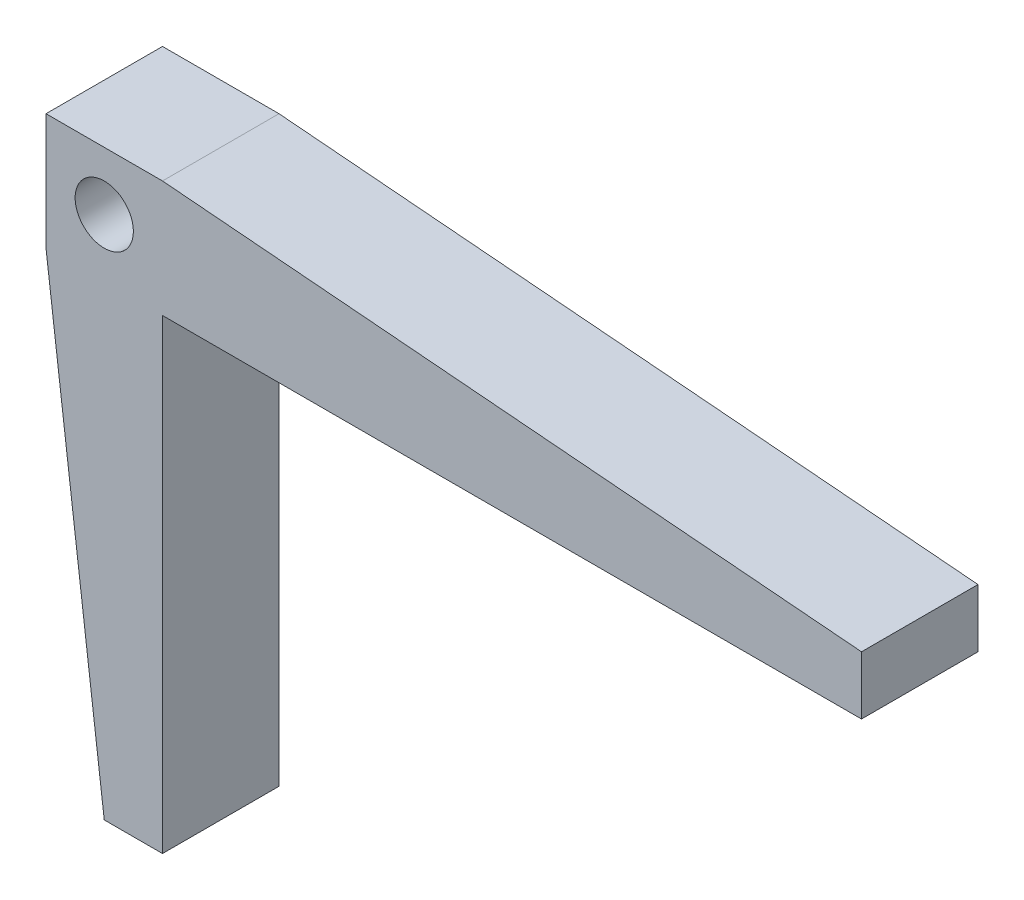
ISO-10303-21;
HEADER;
FILE_DESCRIPTION(('STEP AP214'),'2;1');
FILE_NAME('part.step','',(''),(''),'','','');
FILE_SCHEMA(('AUTOMOTIVE_DESIGN { 1 0 10303 214 1 1 1 1 }'));
ENDSEC;
DATA;
#1=APPLICATION_CONTEXT('core data for automotive mechanical design processes');
#2=APPLICATION_PROTOCOL_DEFINITION('international standard','automotive_design',2000,#1);
#3=PRODUCT_CONTEXT('',#1,'mechanical');
#4=PRODUCT('Part','Part','',(#3));
#5=PRODUCT_RELATED_PRODUCT_CATEGORY('part','',(#4));
#6=PRODUCT_DEFINITION_FORMATION('','',#4);
#7=PRODUCT_DEFINITION_CONTEXT('part definition',#1,'design');
#8=PRODUCT_DEFINITION('design','',#6,#7);
#9=PRODUCT_DEFINITION_SHAPE('','',#8);
#10=(LENGTH_UNIT() NAMED_UNIT(*) SI_UNIT(.MILLI.,.METRE.));
#11=(NAMED_UNIT(*) PLANE_ANGLE_UNIT() SI_UNIT($,.RADIAN.));
#12=(NAMED_UNIT(*) SI_UNIT($,.STERADIAN.) SOLID_ANGLE_UNIT());
#13=UNCERTAINTY_MEASURE_WITH_UNIT(LENGTH_MEASURE(1.E-05),#10,'distance_accuracy_value','');
#14=(GEOMETRIC_REPRESENTATION_CONTEXT(3) GLOBAL_UNCERTAINTY_ASSIGNED_CONTEXT((#13)) GLOBAL_UNIT_ASSIGNED_CONTEXT((#10,
#11,#12)) REPRESENTATION_CONTEXT('',''));
#15=CARTESIAN_POINT('',(0.,0.,0.));
#16=DIRECTION('',(0.,0.,1.));
#17=DIRECTION('',(1.,0.,0.));
#18=AXIS2_PLACEMENT_3D('',#15,#16,#17);
#19=CARTESIAN_POINT('',(0.,0.,25.4));
#20=DIRECTION('',(0.,0.,1.));
#21=DIRECTION('',(1.,0.,0.));
#22=AXIS2_PLACEMENT_3D('',#19,#20,#21);
#23=PLANE('',#22);
#24=DIRECTION('',(1.,0.,0.));
#25=VECTOR('',#24,1.);
#26=CARTESIAN_POINT('',(152.4,0.,25.4));
#27=LINE('',#26,#25);
#28=CARTESIAN_POINT('',(0.,0.,25.4));
#29=VERTEX_POINT('',#28);
#30=CARTESIAN_POINT('',(152.4,0.,25.4));
#31=VERTEX_POINT('',#30);
#32=EDGE_CURVE('E145',#29,#31,#27,.T.);
#33=ORIENTED_EDGE('',*,*,#32,.T.);
#34=DIRECTION('',(0.,1.,0.));
#35=VECTOR('',#34,1.);
#36=CARTESIAN_POINT('',(152.4,12.7,25.4));
#37=LINE('',#36,#35);
#38=CARTESIAN_POINT('',(152.4,12.7,25.4));
#39=VERTEX_POINT('',#38);
#40=EDGE_CURVE('E93',#31,#39,#37,.T.);
#41=ORIENTED_EDGE('',*,*,#40,.T.);
#42=DIRECTION('',(-0.99654575824488,0.0830454798537398,0.));
#43=VECTOR('',#42,1.);
#44=CARTESIAN_POINT('',(0.,25.4,25.4));
#45=LINE('',#44,#43);
#46=CARTESIAN_POINT('',(0.,25.4,25.4));
#47=VERTEX_POINT('',#46);
#48=EDGE_CURVE('E160',#39,#47,#45,.T.);
#49=ORIENTED_EDGE('',*,*,#48,.T.);
#50=DIRECTION('',(-1.,0.,0.));
#51=VECTOR('',#50,1.);
#52=CARTESIAN_POINT('',(-25.4,25.4,25.4));
#53=LINE('',#52,#51);
#54=CARTESIAN_POINT('',(-25.4,25.4,25.4));
#55=VERTEX_POINT('',#54);
#56=EDGE_CURVE('E173',#47,#55,#53,.T.);
#57=ORIENTED_EDGE('',*,*,#56,.T.);
#58=DIRECTION('',(0.,-1.,0.));
#59=VECTOR('',#58,1.);
#60=CARTESIAN_POINT('',(-25.4,0.,25.4));
#61=LINE('',#60,#59);
#62=CARTESIAN_POINT('',(-25.4,0.,25.4));
#63=VERTEX_POINT('',#62);
#64=EDGE_CURVE('E112',#55,#63,#61,.T.);
#65=ORIENTED_EDGE('',*,*,#64,.T.);
#66=DIRECTION('',(0.124034734589209,-0.992277876713668,0.));
#67=VECTOR('',#66,1.);
#68=CARTESIAN_POINT('',(-12.7,-101.6,25.4));
#69=LINE('',#68,#67);
#70=CARTESIAN_POINT('',(-12.7,-101.6,25.4));
#71=VERTEX_POINT('',#70);
#72=EDGE_CURVE('E106',#63,#71,#69,.T.);
#73=ORIENTED_EDGE('',*,*,#72,.T.);
#74=DIRECTION('',(1.,0.,0.));
#75=VECTOR('',#74,1.);
#76=CARTESIAN_POINT('',(0.,-101.6,25.4));
#77=LINE('',#76,#75);
#78=CARTESIAN_POINT('',(0.,-101.6,25.4));
#79=VERTEX_POINT('',#78);
#80=EDGE_CURVE('E110',#71,#79,#77,.T.);
#81=ORIENTED_EDGE('',*,*,#80,.T.);
#82=DIRECTION('',(0.,1.,0.));
#83=VECTOR('',#82,1.);
#84=CARTESIAN_POINT('',(0.,0.,25.4));
#85=LINE('',#84,#83);
#86=EDGE_CURVE('E50',#79,#29,#85,.T.);
#87=ORIENTED_EDGE('',*,*,#86,.T.);
#88=EDGE_LOOP('',(#33,#41,#49,#57,#65,#73,#81,#87));
#89=FACE_BOUND('',#88,.T.);
#90=CARTESIAN_POINT('',(-12.7,12.7,25.4));
#91=DIRECTION('',(0.,0.,1.));
#92=DIRECTION('',(1.,0.,0.));
#93=AXIS2_PLACEMENT_3D('',#90,#91,#92);
#94=CIRCLE('',#93,6.35);
#95=CARTESIAN_POINT('',(-6.34999999999999,12.7,25.4));
#96=VERTEX_POINT('',#95);
#97=EDGE_CURVE('E134',#96,#96,#94,.T.);
#98=ORIENTED_EDGE('',*,*,#97,.F.);
#99=EDGE_LOOP('',(#98));
#100=FACE_BOUND('',#99,.T.);
#101=ADVANCED_FACE('F33',(#89,#100),#23,.T.);
#102=CARTESIAN_POINT('',(0.,0.,0.));
#103=DIRECTION('',(0.,0.,1.));
#104=DIRECTION('',(1.,0.,0.));
#105=AXIS2_PLACEMENT_3D('',#102,#103,#104);
#106=PLANE('',#105);
#107=DIRECTION('',(1.,0.,0.));
#108=VECTOR('',#107,1.);
#109=CARTESIAN_POINT('',(152.4,0.,0.));
#110=LINE('',#109,#108);
#111=CARTESIAN_POINT('',(0.,0.,0.));
#112=VERTEX_POINT('',#111);
#113=CARTESIAN_POINT('',(152.4,0.,0.));
#114=VERTEX_POINT('',#113);
#115=EDGE_CURVE('E130',#112,#114,#110,.T.);
#116=ORIENTED_EDGE('',*,*,#115,.F.);
#117=DIRECTION('',(0.,1.,0.));
#118=VECTOR('',#117,1.);
#119=CARTESIAN_POINT('',(0.,0.,0.));
#120=LINE('',#119,#118);
#121=CARTESIAN_POINT('',(0.,-101.6,0.));
#122=VERTEX_POINT('',#121);
#123=EDGE_CURVE('E85',#122,#112,#120,.T.);
#124=ORIENTED_EDGE('',*,*,#123,.F.);
#125=DIRECTION('',(1.,0.,0.));
#126=VECTOR('',#125,1.);
#127=CARTESIAN_POINT('',(0.,-101.6,0.));
#128=LINE('',#127,#126);
#129=CARTESIAN_POINT('',(-12.7,-101.6,0.));
#130=VERTEX_POINT('',#129);
#131=EDGE_CURVE('E79',#130,#122,#128,.T.);
#132=ORIENTED_EDGE('',*,*,#131,.F.);
#133=DIRECTION('',(0.124034734589209,-0.992277876713668,0.));
#134=VECTOR('',#133,1.);
#135=CARTESIAN_POINT('',(-12.7,-101.6,0.));
#136=LINE('',#135,#134);
#137=CARTESIAN_POINT('',(-25.4,0.,0.));
#138=VERTEX_POINT('',#137);
#139=EDGE_CURVE('E120',#138,#130,#136,.T.);
#140=ORIENTED_EDGE('',*,*,#139,.F.);
#141=DIRECTION('',(0.,-1.,0.));
#142=VECTOR('',#141,1.);
#143=CARTESIAN_POINT('',(-25.4,0.,0.));
#144=LINE('',#143,#142);
#145=CARTESIAN_POINT('',(-25.4,25.4,0.));
#146=VERTEX_POINT('',#145);
#147=EDGE_CURVE('E140',#146,#138,#144,.T.);
#148=ORIENTED_EDGE('',*,*,#147,.F.);
#149=DIRECTION('',(-1.,0.,0.));
#150=VECTOR('',#149,1.);
#151=CARTESIAN_POINT('',(-25.4,25.4,0.));
#152=LINE('',#151,#150);
#153=CARTESIAN_POINT('',(0.,25.4,0.));
#154=VERTEX_POINT('',#153);
#155=EDGE_CURVE('E138',#154,#146,#152,.T.);
#156=ORIENTED_EDGE('',*,*,#155,.F.);
#157=DIRECTION('',(-0.99654575824488,0.0830454798537398,0.));
#158=VECTOR('',#157,1.);
#159=CARTESIAN_POINT('',(0.,25.4,0.));
#160=LINE('',#159,#158);
#161=CARTESIAN_POINT('',(152.4,12.7,0.));
#162=VERTEX_POINT('',#161);
#163=EDGE_CURVE('E136',#162,#154,#160,.T.);
#164=ORIENTED_EDGE('',*,*,#163,.F.);
#165=DIRECTION('',(0.,1.,0.));
#166=VECTOR('',#165,1.);
#167=CARTESIAN_POINT('',(152.4,12.7,0.));
#168=LINE('',#167,#166);
#169=EDGE_CURVE('E133',#114,#162,#168,.T.);
#170=ORIENTED_EDGE('',*,*,#169,.F.);
#171=EDGE_LOOP('',(#116,#124,#132,#140,#148,#156,#164,#170));
#172=FACE_BOUND('',#171,.T.);
#173=CARTESIAN_POINT('',(-12.7,12.7,0.));
#174=DIRECTION('',(0.,0.,1.));
#175=DIRECTION('',(1.,0.,0.));
#176=AXIS2_PLACEMENT_3D('',#173,#174,#175);
#177=CIRCLE('',#176,6.35);
#178=CARTESIAN_POINT('',(-6.34999999999999,12.7,0.));
#179=VERTEX_POINT('',#178);
#180=EDGE_CURVE('E179',#179,#179,#177,.T.);
#181=ORIENTED_EDGE('',*,*,#180,.T.);
#182=EDGE_LOOP('',(#181));
#183=FACE_BOUND('',#182,.T.);
#184=ADVANCED_FACE('F164',(#172,#183),#106,.F.);
#185=CARTESIAN_POINT('',(152.4,0.,25.4));
#186=DIRECTION('',(0.,1.,0.));
#187=DIRECTION('',(0.,0.,1.));
#188=AXIS2_PLACEMENT_3D('',#185,#186,#187);
#189=PLANE('',#188);
#190=ORIENTED_EDGE('',*,*,#115,.T.);
#191=DIRECTION('',(0.,0.,-1.));
#192=VECTOR('',#191,1.);
#193=CARTESIAN_POINT('',(152.4,0.,25.4));
#194=LINE('',#193,#192);
#195=EDGE_CURVE('E11',#31,#114,#194,.T.);
#196=ORIENTED_EDGE('',*,*,#195,.F.);
#197=ORIENTED_EDGE('',*,*,#32,.F.);
#198=DIRECTION('',(0.,0.,-1.));
#199=VECTOR('',#198,1.);
#200=CARTESIAN_POINT('',(0.,0.,25.4));
#201=LINE('',#200,#199);
#202=EDGE_CURVE('E126',#29,#112,#201,.T.);
#203=ORIENTED_EDGE('',*,*,#202,.T.);
#204=EDGE_LOOP('',(#190,#196,#197,#203));
#205=FACE_BOUND('',#204,.T.);
#206=ADVANCED_FACE('F35',(#205),#189,.F.);
#207=CARTESIAN_POINT('',(152.4,12.7,25.4));
#208=DIRECTION('',(-1.,0.,0.));
#209=DIRECTION('',(0.,0.,1.));
#210=AXIS2_PLACEMENT_3D('',#207,#208,#209);
#211=PLANE('',#210);
#212=ORIENTED_EDGE('',*,*,#169,.T.);
#213=DIRECTION('',(0.,0.,-1.));
#214=VECTOR('',#213,1.);
#215=CARTESIAN_POINT('',(152.4,12.7,25.4));
#216=LINE('',#215,#214);
#217=EDGE_CURVE('E42',#39,#162,#216,.T.);
#218=ORIENTED_EDGE('',*,*,#217,.F.);
#219=ORIENTED_EDGE('',*,*,#40,.F.);
#220=ORIENTED_EDGE('',*,*,#195,.T.);
#221=EDGE_LOOP('',(#212,#218,#219,#220));
#222=FACE_BOUND('',#221,.T.);
#223=ADVANCED_FACE('F207',(#222),#211,.F.);
#224=CARTESIAN_POINT('',(0.,25.4,25.4));
#225=DIRECTION('',(-0.0830454798537398,-0.99654575824488,0.));
#226=DIRECTION('',(0.99654575824488,-0.0830454798537398,0.));
#227=AXIS2_PLACEMENT_3D('',#224,#225,#226);
#228=PLANE('',#227);
#229=ORIENTED_EDGE('',*,*,#163,.T.);
#230=DIRECTION('',(0.,0.,-1.));
#231=VECTOR('',#230,1.);
#232=CARTESIAN_POINT('',(0.,25.4,25.4));
#233=LINE('',#232,#231);
#234=EDGE_CURVE('E152',#47,#154,#233,.T.);
#235=ORIENTED_EDGE('',*,*,#234,.F.);
#236=ORIENTED_EDGE('',*,*,#48,.F.);
#237=ORIENTED_EDGE('',*,*,#217,.T.);
#238=EDGE_LOOP('',(#229,#235,#236,#237));
#239=FACE_BOUND('',#238,.T.);
#240=ADVANCED_FACE('F158',(#239),#228,.F.);
#241=CARTESIAN_POINT('',(-25.4,25.4,25.4));
#242=DIRECTION('',(0.,-1.,0.));
#243=DIRECTION('',(0.,0.,-1.));
#244=AXIS2_PLACEMENT_3D('',#241,#242,#243);
#245=PLANE('',#244);
#246=ORIENTED_EDGE('',*,*,#155,.T.);
#247=DIRECTION('',(0.,0.,-1.));
#248=VECTOR('',#247,1.);
#249=CARTESIAN_POINT('',(-25.4,25.4,25.4));
#250=LINE('',#249,#248);
#251=EDGE_CURVE('E149',#55,#146,#250,.T.);
#252=ORIENTED_EDGE('',*,*,#251,.F.);
#253=ORIENTED_EDGE('',*,*,#56,.F.);
#254=ORIENTED_EDGE('',*,*,#234,.T.);
#255=EDGE_LOOP('',(#246,#252,#253,#254));
#256=FACE_BOUND('',#255,.T.);
#257=ADVANCED_FACE('F169',(#256),#245,.F.);
#258=CARTESIAN_POINT('',(-25.4,0.,25.4));
#259=DIRECTION('',(1.,0.,0.));
#260=DIRECTION('',(0.,0.,-1.));
#261=AXIS2_PLACEMENT_3D('',#258,#259,#260);
#262=PLANE('',#261);
#263=ORIENTED_EDGE('',*,*,#147,.T.);
#264=DIRECTION('',(0.,0.,-1.));
#265=VECTOR('',#264,1.);
#266=CARTESIAN_POINT('',(-25.4,0.,25.4));
#267=LINE('',#266,#265);
#268=EDGE_CURVE('E121',#63,#138,#267,.T.);
#269=ORIENTED_EDGE('',*,*,#268,.F.);
#270=ORIENTED_EDGE('',*,*,#64,.F.);
#271=ORIENTED_EDGE('',*,*,#251,.T.);
#272=EDGE_LOOP('',(#263,#269,#270,#271));
#273=FACE_BOUND('',#272,.T.);
#274=ADVANCED_FACE('F172',(#273),#262,.F.);
#275=CARTESIAN_POINT('',(-12.7,-101.6,25.4));
#276=DIRECTION('',(0.992277876713668,0.124034734589209,0.));
#277=DIRECTION('',(-0.124034734589209,0.992277876713668,0.));
#278=AXIS2_PLACEMENT_3D('',#275,#276,#277);
#279=PLANE('',#278);
#280=ORIENTED_EDGE('',*,*,#139,.T.);
#281=DIRECTION('',(0.,0.,-1.));
#282=VECTOR('',#281,1.);
#283=CARTESIAN_POINT('',(-12.7,-101.6,25.4));
#284=LINE('',#283,#282);
#285=EDGE_CURVE('E117',#71,#130,#284,.T.);
#286=ORIENTED_EDGE('',*,*,#285,.F.);
#287=ORIENTED_EDGE('',*,*,#72,.F.);
#288=ORIENTED_EDGE('',*,*,#268,.T.);
#289=EDGE_LOOP('',(#280,#286,#287,#288));
#290=FACE_BOUND('',#289,.T.);
#291=ADVANCED_FACE('F118',(#290),#279,.F.);
#292=CARTESIAN_POINT('',(0.,-101.6,25.4));
#293=DIRECTION('',(0.,1.,0.));
#294=DIRECTION('',(0.,0.,1.));
#295=AXIS2_PLACEMENT_3D('',#292,#293,#294);
#296=PLANE('',#295);
#297=ORIENTED_EDGE('',*,*,#131,.T.);
#298=DIRECTION('',(0.,0.,-1.));
#299=VECTOR('',#298,1.);
#300=CARTESIAN_POINT('',(0.,-101.6,25.4));
#301=LINE('',#300,#299);
#302=EDGE_CURVE('E122',#79,#122,#301,.T.);
#303=ORIENTED_EDGE('',*,*,#302,.F.);
#304=ORIENTED_EDGE('',*,*,#80,.F.);
#305=ORIENTED_EDGE('',*,*,#285,.T.);
#306=EDGE_LOOP('',(#297,#303,#304,#305));
#307=FACE_BOUND('',#306,.T.);
#308=ADVANCED_FACE('F124',(#307),#296,.F.);
#309=CARTESIAN_POINT('',(0.,0.,25.4));
#310=DIRECTION('',(-1.,0.,0.));
#311=DIRECTION('',(0.,-1.,0.));
#312=AXIS2_PLACEMENT_3D('',#309,#310,#311);
#313=PLANE('',#312);
#314=ORIENTED_EDGE('',*,*,#123,.T.);
#315=ORIENTED_EDGE('',*,*,#202,.F.);
#316=ORIENTED_EDGE('',*,*,#86,.F.);
#317=ORIENTED_EDGE('',*,*,#302,.T.);
#318=EDGE_LOOP('',(#314,#315,#316,#317));
#319=FACE_BOUND('',#318,.T.);
#320=ADVANCED_FACE('F195',(#319),#313,.F.);
#321=CARTESIAN_POINT('',(-12.7,12.7,25.4));
#322=DIRECTION('',(0.,0.,-1.));
#323=DIRECTION('',(-1.,0.,0.));
#324=AXIS2_PLACEMENT_3D('',#321,#322,#323);
#325=CYLINDRICAL_SURFACE('',#324,6.35);
#326=ORIENTED_EDGE('',*,*,#97,.T.);
#327=EDGE_LOOP('',(#326));
#328=FACE_BOUND('',#327,.T.);
#329=ORIENTED_EDGE('',*,*,#180,.F.);
#330=EDGE_LOOP('',(#329));
#331=FACE_BOUND('',#330,.T.);
#332=ADVANCED_FACE('F185',(#328,#331),#325,.F.);
#333=CLOSED_SHELL('',(#101,#184,#206,#223,#240,#257,#274,#291,#308,#320,#332));
#334=MANIFOLD_SOLID_BREP('B2',#333);
#335=ADVANCED_BREP_SHAPE_REPRESENTATION('',(#18,#334),#14);
#336=SHAPE_DEFINITION_REPRESENTATION(#9,#335);
ENDSEC;
END-ISO-10303-21;
